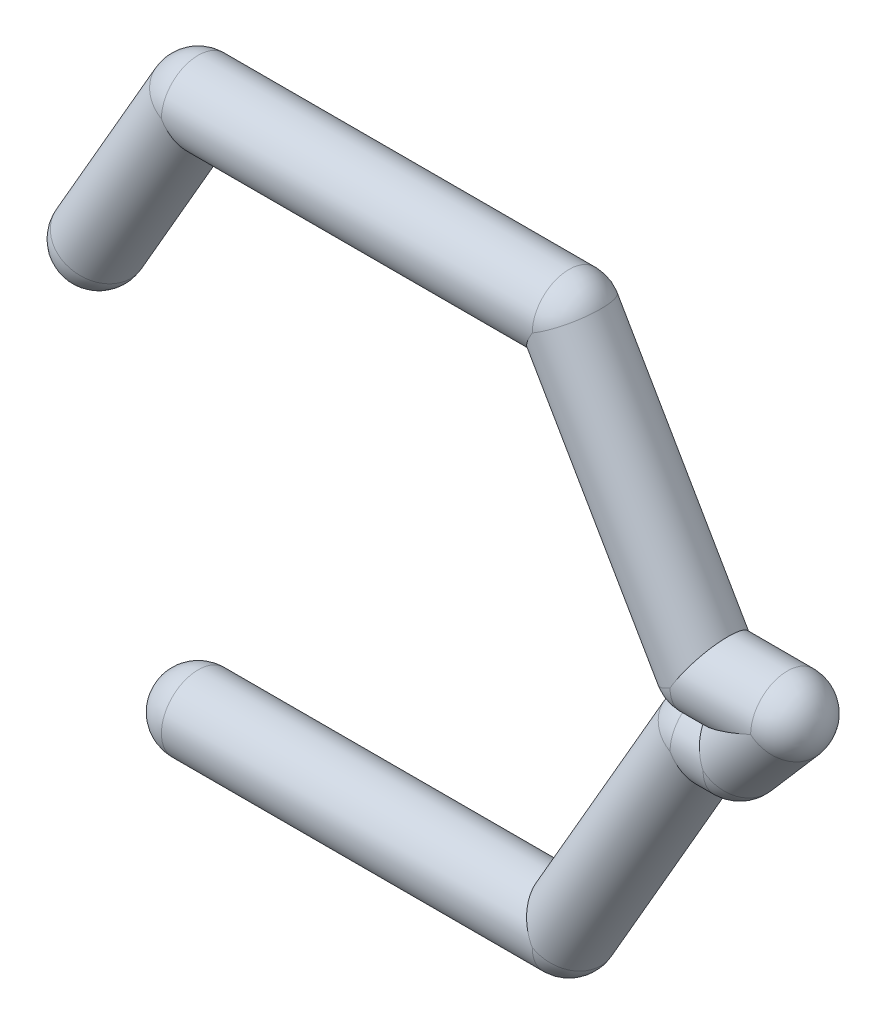
ISO-10303-21;
HEADER;
FILE_DESCRIPTION(('STEP AP214'),'2;1');
FILE_NAME('part.step','',(''),(''),'','','');
FILE_SCHEMA(('AUTOMOTIVE_DESIGN { 1 0 10303 214 1 1 1 1 }'));
ENDSEC;
DATA;
#1=APPLICATION_CONTEXT('core data for automotive mechanical design processes');
#2=APPLICATION_PROTOCOL_DEFINITION('international standard','automotive_design',2000,#1);
#3=PRODUCT_CONTEXT('',#1,'mechanical');
#4=PRODUCT('Part','Part','',(#3));
#5=PRODUCT_RELATED_PRODUCT_CATEGORY('part','',(#4));
#6=PRODUCT_DEFINITION_FORMATION('','',#4);
#7=PRODUCT_DEFINITION_CONTEXT('part definition',#1,'design');
#8=PRODUCT_DEFINITION('design','',#6,#7);
#9=PRODUCT_DEFINITION_SHAPE('','',#8);
#10=(LENGTH_UNIT() NAMED_UNIT(*) SI_UNIT(.MILLI.,.METRE.));
#11=(NAMED_UNIT(*) PLANE_ANGLE_UNIT() SI_UNIT($,.RADIAN.));
#12=(NAMED_UNIT(*) SI_UNIT($,.STERADIAN.) SOLID_ANGLE_UNIT());
#13=UNCERTAINTY_MEASURE_WITH_UNIT(LENGTH_MEASURE(1.E-05),#10,'distance_accuracy_value','');
#14=(GEOMETRIC_REPRESENTATION_CONTEXT(3) GLOBAL_UNCERTAINTY_ASSIGNED_CONTEXT((#13)) GLOBAL_UNIT_ASSIGNED_CONTEXT((#10,
#11,#12)) REPRESENTATION_CONTEXT('',''));
#15=CARTESIAN_POINT('',(0.,0.,0.));
#16=DIRECTION('',(0.,0.,1.));
#17=DIRECTION('',(1.,0.,0.));
#18=AXIS2_PLACEMENT_3D('',#15,#16,#17);
#19=CARTESIAN_POINT('',(-15.164,-10.725,0.825));
#20=DIRECTION('',(1.,0.,0.));
#21=DIRECTION('',(0.,-1.,0.));
#22=AXIS2_PLACEMENT_3D('',#19,#20,#21);
#23=SPHERICAL_SURFACE('',#22,0.24);
#24=CARTESIAN_POINT('',(-15.164,-10.725,0.825));
#25=DIRECTION('',(-0.499700234892811,-0.866198404090004,0.));
#26=DIRECTION('',(0.866198404090004,-0.499700234892811,0.));
#27=AXIS2_PLACEMENT_3D('',#24,#25,#26);
#28=SPHERICAL_SURFACE('',#27,0.24);
#29=CARTESIAN_POINT('',(-15.164,-10.725,0.825));
#30=DIRECTION('',(-0.499700234892811,-0.866198404090004,0.));
#31=DIRECTION('',(0.866198404090004,-0.499700234892811,0.));
#32=AXIS2_PLACEMENT_3D('',#29,#30,#31);
#33=CIRCLE('',#32,0.24);
#34=CARTESIAN_POINT('',(-14.9561123830184,-10.8449280563743,0.825));
#35=VERTEX_POINT('',#34);
#36=EDGE_CURVE('E88',#35,#35,#33,.F.);
#37=ORIENTED_EDGE('',*,*,#36,.F.);
#38=EDGE_LOOP('',(#37));
#39=FACE_BOUND('',#38,.T.);
#40=ADVANCED_FACE('F81',(#39),#28,.T.);
#41=CARTESIAN_POINT('',(-14.515,-9.6,0.825));
#42=DIRECTION('',(-0.499700234892811,-0.866198404090004,0.));
#43=DIRECTION('',(0.866198404090004,-0.499700234892811,0.));
#44=AXIS2_PLACEMENT_3D('',#41,#42,#43);
#45=CYLINDRICAL_SURFACE('',#44,0.24);
#46=CARTESIAN_POINT('',(-14.515,-9.6,0.825));
#47=DIRECTION('',(-0.865938864727993,-0.500149860095546,0.));
#48=DIRECTION('',(0.500149860095547,-0.865938864727993,0.));
#49=AXIS2_PLACEMENT_3D('',#46,#47,#48);
#50=ELLIPSE('',#49,0.277155824476579,0.24);
#51=CARTESIAN_POINT('',(-14.515,-9.6,1.065));
#52=VERTEX_POINT('',#51);
#53=CARTESIAN_POINT('',(-14.515,-9.6,0.585));
#54=VERTEX_POINT('',#53);
#55=EDGE_CURVE('E12',#52,#54,#50,.F.);
#56=ORIENTED_EDGE('',*,*,#55,.F.);
#57=CARTESIAN_POINT('',(-14.515,-9.6,0.825));
#58=DIRECTION('',(-0.499700234892809,-0.866198404090005,0.));
#59=DIRECTION('',(0.866198404090005,-0.499700234892809,0.));
#60=AXIS2_PLACEMENT_3D('',#57,#58,#59);
#61=CIRCLE('',#60,0.24);
#62=EDGE_CURVE('E95',#52,#54,#61,.T.);
#63=ORIENTED_EDGE('',*,*,#62,.T.);
#64=EDGE_LOOP('',(#56,#63));
#65=FACE_BOUND('',#64,.T.);
#66=ORIENTED_EDGE('',*,*,#36,.T.);
#67=EDGE_LOOP('',(#66));
#68=FACE_BOUND('',#67,.T.);
#69=ADVANCED_FACE('F210',(#65,#68),#45,.T.);
#70=CARTESIAN_POINT('',(-14.515,-9.6,0.825));
#71=DIRECTION('',(1.,0.,0.));
#72=DIRECTION('',(0.,-1.,0.));
#73=AXIS2_PLACEMENT_3D('',#70,#71,#72);
#74=SPHERICAL_SURFACE('',#73,0.24);
#75=ORIENTED_EDGE('',*,*,#62,.F.);
#76=CARTESIAN_POINT('',(-14.515,-9.6,0.825));
#77=DIRECTION('',(-1.,0.,0.));
#78=DIRECTION('',(0.,0.,1.));
#79=AXIS2_PLACEMENT_3D('',#76,#77,#78);
#80=CIRCLE('',#79,0.24);
#81=EDGE_CURVE('E201',#54,#52,#80,.F.);
#82=ORIENTED_EDGE('',*,*,#81,.F.);
#83=EDGE_LOOP('',(#75,#82));
#84=FACE_BOUND('',#83,.T.);
#85=ADVANCED_FACE('F216',(#84),#74,.T.);
#86=CARTESIAN_POINT('',(-12.09,-9.6,0.825));
#87=DIRECTION('',(-1.,0.,0.));
#88=DIRECTION('',(0.,0.,1.));
#89=AXIS2_PLACEMENT_3D('',#86,#87,#88);
#90=CYLINDRICAL_SURFACE('',#89,0.24);
#91=CARTESIAN_POINT('',(-12.09,-9.6,0.825));
#92=DIRECTION('',(-0.866065491045954,0.499930560397472,0.));
#93=DIRECTION('',(-0.499930560397472,-0.866065491045954,0.));
#94=AXIS2_PLACEMENT_3D('',#91,#92,#93);
#95=ELLIPSE('',#94,0.277115301881096,0.24);
#96=CARTESIAN_POINT('',(-12.09,-9.6,1.065));
#97=VERTEX_POINT('',#96);
#98=CARTESIAN_POINT('',(-12.09,-9.6,0.585));
#99=VERTEX_POINT('',#98);
#100=EDGE_CURVE('E204',#97,#99,#95,.F.);
#101=ORIENTED_EDGE('',*,*,#100,.F.);
#102=CARTESIAN_POINT('',(-12.09,-9.6,0.825));
#103=DIRECTION('',(-1.,0.,0.));
#104=DIRECTION('',(0.,0.,1.));
#105=AXIS2_PLACEMENT_3D('',#102,#103,#104);
#106=CIRCLE('',#105,0.24);
#107=EDGE_CURVE('E199',#97,#99,#106,.T.);
#108=ORIENTED_EDGE('',*,*,#107,.T.);
#109=EDGE_LOOP('',(#101,#108));
#110=FACE_BOUND('',#109,.T.);
#111=ORIENTED_EDGE('',*,*,#81,.T.);
#112=ORIENTED_EDGE('',*,*,#55,.T.);
#113=EDGE_LOOP('',(#111,#112));
#114=FACE_BOUND('',#113,.T.);
#115=ADVANCED_FACE('F220',(#110,#114),#90,.T.);
#116=CARTESIAN_POINT('',(-12.09,-9.6,0.825));
#117=DIRECTION('',(1.,0.,0.));
#118=DIRECTION('',(0.,-1.,0.));
#119=AXIS2_PLACEMENT_3D('',#116,#117,#118);
#120=SPHERICAL_SURFACE('',#119,0.24);
#121=ORIENTED_EDGE('',*,*,#107,.F.);
#122=CARTESIAN_POINT('',(-12.09,-9.6,0.825));
#123=DIRECTION('',(-0.500138869561338,0.865945212559032,0.));
#124=DIRECTION('',(-0.865945212559032,-0.500138869561338,0.));
#125=AXIS2_PLACEMENT_3D('',#122,#123,#124);
#126=CIRCLE('',#125,0.24);
#127=EDGE_CURVE('E194',#99,#97,#126,.F.);
#128=ORIENTED_EDGE('',*,*,#127,.F.);
#129=EDGE_LOOP('',(#121,#128));
#130=FACE_BOUND('',#129,.T.);
#131=ADVANCED_FACE('F226',(#130),#120,.T.);
#132=CARTESIAN_POINT('',(-11.189,-11.16,0.825));
#133=DIRECTION('',(-0.500138869561338,0.865945212559032,0.));
#134=DIRECTION('',(-0.865945212559032,-0.500138869561338,0.));
#135=AXIS2_PLACEMENT_3D('',#132,#133,#134);
#136=CYLINDRICAL_SURFACE('',#135,0.239999999999999);
#137=CARTESIAN_POINT('',(-11.189,-11.16,0.825));
#138=DIRECTION('',(-0.866065491045954,0.499930560397472,0.));
#139=DIRECTION('',(0.499930560397472,0.866065491045954,0.));
#140=AXIS2_PLACEMENT_3D('',#137,#138,#139);
#141=ELLIPSE('',#140,0.277115301881096,0.24);
#142=CARTESIAN_POINT('',(-11.189,-11.16,0.585000000000001));
#143=VERTEX_POINT('',#142);
#144=CARTESIAN_POINT('',(-11.189,-11.16,1.065));
#145=VERTEX_POINT('',#144);
#146=EDGE_CURVE('E197',#143,#145,#141,.F.);
#147=ORIENTED_EDGE('',*,*,#146,.F.);
#148=CARTESIAN_POINT('',(-11.189,-11.16,0.825));
#149=DIRECTION('',(-0.500138869561341,0.86594521255903,0.));
#150=DIRECTION('',(-0.86594521255903,-0.500138869561341,0.));
#151=AXIS2_PLACEMENT_3D('',#148,#149,#150);
#152=CIRCLE('',#151,0.239999999999999);
#153=EDGE_CURVE('E153',#143,#145,#152,.T.);
#154=ORIENTED_EDGE('',*,*,#153,.T.);
#155=EDGE_LOOP('',(#147,#154));
#156=FACE_BOUND('',#155,.T.);
#157=ORIENTED_EDGE('',*,*,#127,.T.);
#158=ORIENTED_EDGE('',*,*,#100,.T.);
#159=EDGE_LOOP('',(#157,#158));
#160=FACE_BOUND('',#159,.T.);
#161=ADVANCED_FACE('F230',(#156,#160),#136,.T.);
#162=CARTESIAN_POINT('',(-11.189,-11.16,0.825));
#163=DIRECTION('',(1.,0.,0.));
#164=DIRECTION('',(0.,-1.,0.));
#165=AXIS2_PLACEMENT_3D('',#162,#163,#164);
#166=SPHERICAL_SURFACE('',#165,0.24);
#167=ORIENTED_EDGE('',*,*,#153,.F.);
#168=CARTESIAN_POINT('',(-11.189,-11.16,0.825));
#169=DIRECTION('',(-1.,0.,0.));
#170=DIRECTION('',(0.,0.,1.));
#171=AXIS2_PLACEMENT_3D('',#168,#169,#170);
#172=CIRCLE('',#171,0.24);
#173=CARTESIAN_POINT('',(-11.189,-11.34,0.666254921336124));
#174=VERTEX_POINT('',#173);
#175=EDGE_CURVE('E146',#143,#174,#172,.T.);
#176=ORIENTED_EDGE('',*,*,#175,.T.);
#177=CARTESIAN_POINT('',(-11.189,-11.34,0.825));
#178=DIRECTION('',(0.,1.,0.));
#179=DIRECTION('',(0.,0.,1.));
#180=AXIS2_PLACEMENT_3D('',#177,#178,#179);
#181=CIRCLE('',#180,0.158745078663876);
#182=CARTESIAN_POINT('',(-11.189,-11.34,0.983745078663876));
#183=VERTEX_POINT('',#182);
#184=EDGE_CURVE('E151',#174,#183,#181,.T.);
#185=ORIENTED_EDGE('',*,*,#184,.T.);
#186=EDGE_CURVE('E158',#183,#145,#172,.T.);
#187=ORIENTED_EDGE('',*,*,#186,.T.);
#188=EDGE_LOOP('',(#167,#176,#185,#187));
#189=FACE_BOUND('',#188,.T.);
#190=ADVANCED_FACE('F148',(#189),#166,.T.);
#191=CARTESIAN_POINT('',(-10.662,-11.16,0.825));
#192=DIRECTION('',(1.,0.,0.));
#193=DIRECTION('',(0.,-1.,0.));
#194=AXIS2_PLACEMENT_3D('',#191,#192,#193);
#195=SPHERICAL_SURFACE('',#194,0.24);
#196=CARTESIAN_POINT('',(-10.662,-11.16,0.825));
#197=DIRECTION('',(0.653729317990234,0.756728470985481,0.));
#198=DIRECTION('',(-0.756728470985481,0.653729317990234,0.));
#199=AXIS2_PLACEMENT_3D('',#196,#197,#198);
#200=CIRCLE('',#199,0.24);
#201=CARTESIAN_POINT('',(-10.662,-11.16,0.585));
#202=VERTEX_POINT('',#201);
#203=CARTESIAN_POINT('',(-10.662,-11.16,1.065));
#204=VERTEX_POINT('',#203);
#205=EDGE_CURVE('E387',#202,#204,#200,.F.);
#206=ORIENTED_EDGE('',*,*,#205,.F.);
#207=CARTESIAN_POINT('',(-10.662,-11.16,0.825));
#208=DIRECTION('',(-1.,0.,0.));
#209=DIRECTION('',(0.,0.,1.));
#210=AXIS2_PLACEMENT_3D('',#207,#208,#209);
#211=CIRCLE('',#210,0.24);
#212=EDGE_CURVE('E159',#204,#202,#211,.T.);
#213=ORIENTED_EDGE('',*,*,#212,.F.);
#214=EDGE_LOOP('',(#206,#213));
#215=FACE_BOUND('',#214,.T.);
#216=ADVANCED_FACE('F235',(#215),#195,.T.);
#217=CARTESIAN_POINT('',(-10.973,-11.52,0.825));
#218=DIRECTION('',(0.653729317990234,0.756728470985481,0.));
#219=DIRECTION('',(-0.756728470985481,0.653729317990234,0.));
#220=AXIS2_PLACEMENT_3D('',#217,#218,#219);
#221=CYLINDRICAL_SURFACE('',#220,0.240000000000001);
#222=CARTESIAN_POINT('',(-10.662,-11.16,0.825));
#223=DIRECTION('',(-0.416095350857088,0.909320987877832,0.));
#224=DIRECTION('',(0.909320987877832,0.416095350857088,0.));
#225=AXIS2_PLACEMENT_3D('',#222,#223,#224);
#226=ELLIPSE('',#225,0.576790871384743,0.24);
#227=CARTESIAN_POINT('',(-11.0553660337249,-11.34,0.666254921336124));
#228=VERTEX_POINT('',#227);
#229=EDGE_CURVE('E182',#202,#228,#226,.T.);
#230=ORIENTED_EDGE('',*,*,#229,.F.);
#231=ORIENTED_EDGE('',*,*,#205,.T.);
#232=CARTESIAN_POINT('',(-11.0553660337249,-11.34,0.983745078663876));
#233=VERTEX_POINT('',#232);
#234=EDGE_CURVE('E393',#233,#204,#226,.T.);
#235=ORIENTED_EDGE('',*,*,#234,.F.);
#236=CARTESIAN_POINT('',(-10.973,-11.52,0.825));
#237=DIRECTION('',(0.909320987877832,0.416095350857088,0.));
#238=DIRECTION('',(-0.416095350857088,0.909320987877832,0.));
#239=AXIS2_PLACEMENT_3D('',#236,#237,#238);
#240=ELLIPSE('',#239,0.263933202025954,0.24);
#241=CARTESIAN_POINT('',(-10.973,-11.52,1.065));
#242=VERTEX_POINT('',#241);
#243=EDGE_CURVE('E184',#242,#233,#240,.F.);
#244=ORIENTED_EDGE('',*,*,#243,.F.);
#245=CARTESIAN_POINT('',(-10.973,-11.52,0.825));
#246=DIRECTION('',(0.653729317990246,0.756728470985471,0.));
#247=DIRECTION('',(-0.756728470985471,0.653729317990246,0.));
#248=AXIS2_PLACEMENT_3D('',#245,#246,#247);
#249=CIRCLE('',#248,0.240000000000001);
#250=CARTESIAN_POINT('',(-10.973,-11.52,0.585));
#251=VERTEX_POINT('',#250);
#252=EDGE_CURVE('E382',#242,#251,#249,.T.);
#253=ORIENTED_EDGE('',*,*,#252,.T.);
#254=EDGE_CURVE('E189',#228,#251,#240,.F.);
#255=ORIENTED_EDGE('',*,*,#254,.F.);
#256=EDGE_LOOP('',(#230,#231,#235,#244,#253,#255));
#257=FACE_BOUND('',#256,.T.);
#258=ADVANCED_FACE('F238',(#257),#221,.T.);
#259=CARTESIAN_POINT('',(-10.973,-11.52,0.825));
#260=DIRECTION('',(1.,0.,0.));
#261=DIRECTION('',(0.,-1.,0.));
#262=AXIS2_PLACEMENT_3D('',#259,#260,#261);
#263=SPHERICAL_SURFACE('',#262,0.24);
#264=ORIENTED_EDGE('',*,*,#252,.F.);
#265=CARTESIAN_POINT('',(-10.973,-11.52,0.825));
#266=DIRECTION('',(1.,0.,0.));
#267=DIRECTION('',(0.,0.,-1.));
#268=AXIS2_PLACEMENT_3D('',#265,#266,#267);
#269=CIRCLE('',#268,0.24);
#270=EDGE_CURVE('E379',#251,#242,#269,.F.);
#271=ORIENTED_EDGE('',*,*,#270,.F.);
#272=EDGE_LOOP('',(#264,#271));
#273=FACE_BOUND('',#272,.T.);
#274=ADVANCED_FACE('F242',(#273),#263,.T.);
#275=CARTESIAN_POINT('',(-11.189,-11.52,0.825));
#276=DIRECTION('',(1.,0.,0.));
#277=DIRECTION('',(0.,-1.,0.));
#278=AXIS2_PLACEMENT_3D('',#275,#276,#277);
#279=SPHERICAL_SURFACE('',#278,0.24);
#280=CARTESIAN_POINT('',(-11.189,-11.52,0.825));
#281=DIRECTION('',(0.500138869561338,0.865945212559032,0.));
#282=DIRECTION('',(-0.865945212559032,0.500138869561338,0.));
#283=AXIS2_PLACEMENT_3D('',#280,#281,#282);
#284=CIRCLE('',#283,0.24);
#285=CARTESIAN_POINT('',(-11.189,-11.52,1.065));
#286=VERTEX_POINT('',#285);
#287=CARTESIAN_POINT('',(-11.189,-11.52,0.585));
#288=VERTEX_POINT('',#287);
#289=EDGE_CURVE('E373',#286,#288,#284,.F.);
#290=ORIENTED_EDGE('',*,*,#289,.F.);
#291=CARTESIAN_POINT('',(-11.189,-11.52,0.825));
#292=DIRECTION('',(1.,0.,0.));
#293=DIRECTION('',(0.,0.,-1.));
#294=AXIS2_PLACEMENT_3D('',#291,#292,#293);
#295=CIRCLE('',#294,0.24);
#296=EDGE_CURVE('E173',#183,#286,#295,.T.);
#297=ORIENTED_EDGE('',*,*,#296,.F.);
#298=ORIENTED_EDGE('',*,*,#184,.F.);
#299=EDGE_CURVE('E163',#288,#174,#295,.T.);
#300=ORIENTED_EDGE('',*,*,#299,.F.);
#301=EDGE_LOOP('',(#290,#297,#298,#300));
#302=FACE_BOUND('',#301,.T.);
#303=ADVANCED_FACE('F175',(#302),#279,.T.);
#304=CARTESIAN_POINT('',(-12.09,-13.08,0.825));
#305=DIRECTION('',(0.500138869561338,0.865945212559032,0.));
#306=DIRECTION('',(-0.865945212559032,0.500138869561338,0.));
#307=AXIS2_PLACEMENT_3D('',#304,#305,#306);
#308=CYLINDRICAL_SURFACE('',#307,0.240000000000001);
#309=CARTESIAN_POINT('',(-11.189,-11.52,0.825));
#310=DIRECTION('',(0.866065491045954,0.499930560397472,0.));
#311=DIRECTION('',(-0.499930560397472,0.866065491045954,0.));
#312=AXIS2_PLACEMENT_3D('',#309,#310,#311);
#313=ELLIPSE('',#312,0.277115301881097,0.24);
#314=EDGE_CURVE('E169',#286,#288,#313,.T.);
#315=ORIENTED_EDGE('',*,*,#314,.F.);
#316=ORIENTED_EDGE('',*,*,#289,.T.);
#317=EDGE_LOOP('',(#315,#316));
#318=FACE_BOUND('',#317,.T.);
#319=CARTESIAN_POINT('',(-12.09,-13.08,0.825));
#320=DIRECTION('',(0.866065491045954,0.499930560397472,0.));
#321=DIRECTION('',(-0.499930560397472,0.866065491045954,0.));
#322=AXIS2_PLACEMENT_3D('',#319,#320,#321);
#323=ELLIPSE('',#322,0.277115301881097,0.24);
#324=CARTESIAN_POINT('',(-12.09,-13.08,1.065));
#325=VERTEX_POINT('',#324);
#326=CARTESIAN_POINT('',(-12.09,-13.08,0.584999999999999));
#327=VERTEX_POINT('',#326);
#328=EDGE_CURVE('E376',#325,#327,#323,.F.);
#329=ORIENTED_EDGE('',*,*,#328,.F.);
#330=CARTESIAN_POINT('',(-12.09,-13.08,0.825));
#331=DIRECTION('',(0.500138869561338,0.865945212559032,0.));
#332=DIRECTION('',(-0.865945212559032,0.500138869561338,0.));
#333=AXIS2_PLACEMENT_3D('',#330,#331,#332);
#334=CIRCLE('',#333,0.240000000000001);
#335=EDGE_CURVE('E176',#325,#327,#334,.T.);
#336=ORIENTED_EDGE('',*,*,#335,.T.);
#337=EDGE_LOOP('',(#329,#336));
#338=FACE_BOUND('',#337,.T.);
#339=ADVANCED_FACE('F246',(#318,#338),#308,.T.);
#340=CARTESIAN_POINT('',(-12.09,-13.08,0.825));
#341=DIRECTION('',(1.,0.,0.));
#342=DIRECTION('',(0.,-1.,0.));
#343=AXIS2_PLACEMENT_3D('',#340,#341,#342);
#344=SPHERICAL_SURFACE('',#343,0.24);
#345=ORIENTED_EDGE('',*,*,#335,.F.);
#346=CARTESIAN_POINT('',(-12.09,-13.08,0.825));
#347=DIRECTION('',(1.,0.,0.));
#348=DIRECTION('',(0.,0.,-1.));
#349=AXIS2_PLACEMENT_3D('',#346,#347,#348);
#350=CIRCLE('',#349,0.24);
#351=EDGE_CURVE('E177',#325,#327,#350,.T.);
#352=ORIENTED_EDGE('',*,*,#351,.T.);
#353=EDGE_LOOP('',(#345,#352));
#354=FACE_BOUND('',#353,.T.);
#355=ADVANCED_FACE('F249',(#354),#344,.T.);
#356=CARTESIAN_POINT('',(-14.515,-13.08,0.825));
#357=DIRECTION('',(1.,0.,0.));
#358=DIRECTION('',(0.,0.,-1.));
#359=AXIS2_PLACEMENT_3D('',#356,#357,#358);
#360=CYLINDRICAL_SURFACE('',#359,0.24);
#361=ORIENTED_EDGE('',*,*,#351,.F.);
#362=ORIENTED_EDGE('',*,*,#328,.T.);
#363=EDGE_LOOP('',(#361,#362));
#364=FACE_BOUND('',#363,.T.);
#365=CARTESIAN_POINT('',(-14.515,-13.08,0.825));
#366=DIRECTION('',(1.,0.,0.));
#367=DIRECTION('',(0.,0.,-1.));
#368=AXIS2_PLACEMENT_3D('',#365,#366,#367);
#369=CIRCLE('',#368,0.24);
#370=CARTESIAN_POINT('',(-14.515,-13.08,0.585));
#371=VERTEX_POINT('',#370);
#372=EDGE_CURVE('E377',#371,#371,#369,.T.);
#373=ORIENTED_EDGE('',*,*,#372,.T.);
#374=EDGE_LOOP('',(#373));
#375=FACE_BOUND('',#374,.T.);
#376=ADVANCED_FACE('F259',(#364,#375),#360,.T.);
#377=CARTESIAN_POINT('',(-14.515,-13.08,0.825));
#378=DIRECTION('',(1.,0.,0.));
#379=DIRECTION('',(0.,-1.,0.));
#380=AXIS2_PLACEMENT_3D('',#377,#378,#379);
#381=SPHERICAL_SURFACE('',#380,0.24);
#382=ORIENTED_EDGE('',*,*,#372,.F.);
#383=EDGE_LOOP('',(#382));
#384=FACE_BOUND('',#383,.T.);
#385=ADVANCED_FACE('F256',(#384),#381,.T.);
#386=CARTESIAN_POINT('',(-11.189,-11.52,0.825));
#387=DIRECTION('',(1.,0.,0.));
#388=DIRECTION('',(0.,0.,-1.));
#389=AXIS2_PLACEMENT_3D('',#386,#387,#388);
#390=CYLINDRICAL_SURFACE('',#389,0.24);
#391=DIRECTION('',(-1.,0.,0.));
#392=VECTOR('',#391,1.);
#393=CARTESIAN_POINT('',(-10.9255,-11.34,0.983745078663876));
#394=LINE('',#393,#392);
#395=EDGE_CURVE('E183',#183,#233,#394,.F.);
#396=ORIENTED_EDGE('',*,*,#395,.F.);
#397=ORIENTED_EDGE('',*,*,#296,.T.);
#398=ORIENTED_EDGE('',*,*,#314,.T.);
#399=ORIENTED_EDGE('',*,*,#299,.T.);
#400=DIRECTION('',(-1.,0.,0.));
#401=VECTOR('',#400,1.);
#402=CARTESIAN_POINT('',(-10.9255,-11.34,0.666254921336124));
#403=LINE('',#402,#401);
#404=EDGE_CURVE('E166',#228,#174,#403,.T.);
#405=ORIENTED_EDGE('',*,*,#404,.F.);
#406=ORIENTED_EDGE('',*,*,#254,.T.);
#407=ORIENTED_EDGE('',*,*,#270,.T.);
#408=ORIENTED_EDGE('',*,*,#243,.T.);
#409=EDGE_LOOP('',(#396,#397,#398,#399,#405,#406,#407,#408));
#410=FACE_BOUND('',#409,.T.);
#411=ADVANCED_FACE('F165',(#410),#390,.T.);
#412=CARTESIAN_POINT('',(-10.662,-11.16,0.825));
#413=DIRECTION('',(-1.,0.,0.));
#414=DIRECTION('',(0.,0.,1.));
#415=AXIS2_PLACEMENT_3D('',#412,#413,#414);
#416=CYLINDRICAL_SURFACE('',#415,0.24);
#417=ORIENTED_EDGE('',*,*,#175,.F.);
#418=ORIENTED_EDGE('',*,*,#146,.T.);
#419=ORIENTED_EDGE('',*,*,#186,.F.);
#420=ORIENTED_EDGE('',*,*,#395,.T.);
#421=ORIENTED_EDGE('',*,*,#234,.T.);
#422=ORIENTED_EDGE('',*,*,#212,.T.);
#423=ORIENTED_EDGE('',*,*,#229,.T.);
#424=ORIENTED_EDGE('',*,*,#404,.T.);
#425=EDGE_LOOP('',(#417,#418,#419,#420,#421,#422,#423,#424));
#426=FACE_BOUND('',#425,.T.);
#427=ADVANCED_FACE('F180',(#426),#416,.T.);
#428=CLOSED_SHELL('',(#40,#69,#85,#115,#131,#161,#190,#216,#258,#274,#303,#339,#355,#376,#385,
#411,#427));
#429=MANIFOLD_SOLID_BREP('B2',#428);
#430=ADVANCED_BREP_SHAPE_REPRESENTATION('',(#18,#429),#14);
#431=SHAPE_DEFINITION_REPRESENTATION(#9,#430);
ENDSEC;
END-ISO-10303-21;
